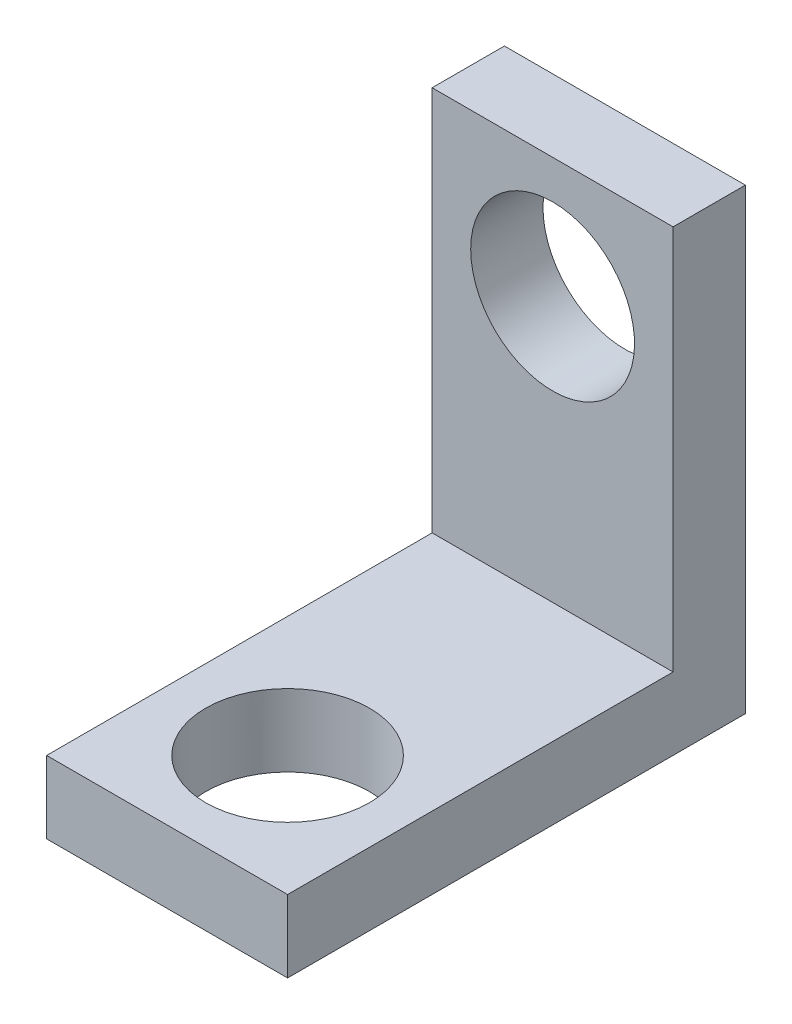
ISO-10303-21;
HEADER;
FILE_DESCRIPTION(('STEP AP214'),'2;1');
FILE_NAME('part.step','',(''),(''),'','','');
FILE_SCHEMA(('AUTOMOTIVE_DESIGN { 1 0 10303 214 1 1 1 1 }'));
ENDSEC;
DATA;
#1=APPLICATION_CONTEXT('core data for automotive mechanical design processes');
#2=APPLICATION_PROTOCOL_DEFINITION('international standard','automotive_design',2000,#1);
#3=PRODUCT_CONTEXT('',#1,'mechanical');
#4=PRODUCT('Part','Part','',(#3));
#5=PRODUCT_RELATED_PRODUCT_CATEGORY('part','',(#4));
#6=PRODUCT_DEFINITION_FORMATION('','',#4);
#7=PRODUCT_DEFINITION_CONTEXT('part definition',#1,'design');
#8=PRODUCT_DEFINITION('design','',#6,#7);
#9=PRODUCT_DEFINITION_SHAPE('','',#8);
#10=(LENGTH_UNIT() NAMED_UNIT(*) SI_UNIT(.MILLI.,.METRE.));
#11=(NAMED_UNIT(*) PLANE_ANGLE_UNIT() SI_UNIT($,.RADIAN.));
#12=(NAMED_UNIT(*) SI_UNIT($,.STERADIAN.) SOLID_ANGLE_UNIT());
#13=UNCERTAINTY_MEASURE_WITH_UNIT(LENGTH_MEASURE(1.E-05),#10,'distance_accuracy_value','');
#14=(GEOMETRIC_REPRESENTATION_CONTEXT(3) GLOBAL_UNCERTAINTY_ASSIGNED_CONTEXT((#13)) GLOBAL_UNIT_ASSIGNED_CONTEXT((#10,
#11,#12)) REPRESENTATION_CONTEXT('',''));
#15=CARTESIAN_POINT('',(0.,0.,0.));
#16=DIRECTION('',(0.,0.,1.));
#17=DIRECTION('',(1.,0.,0.));
#18=AXIS2_PLACEMENT_3D('',#15,#16,#17);
#19=CARTESIAN_POINT('',(5.,4.75,0.));
#20=DIRECTION('',(0.,1.,0.));
#21=DIRECTION('',(0.,0.,1.));
#22=AXIS2_PLACEMENT_3D('',#19,#20,#21);
#23=PLANE('',#22);
#24=DIRECTION('',(0.,0.,-1.));
#25=VECTOR('',#24,1.);
#26=CARTESIAN_POINT('',(0.,4.75,0.));
#27=LINE('',#26,#25);
#28=CARTESIAN_POINT('',(0.,4.75,-3.25));
#29=VERTEX_POINT('',#28);
#30=CARTESIAN_POINT('',(0.,4.75,-4.75));
#31=VERTEX_POINT('',#30);
#32=EDGE_CURVE('E117',#29,#31,#27,.T.);
#33=ORIENTED_EDGE('',*,*,#32,.F.);
#34=DIRECTION('',(-1.,0.,0.));
#35=VECTOR('',#34,1.);
#36=CARTESIAN_POINT('',(5.,4.75,-3.25));
#37=LINE('',#36,#35);
#38=CARTESIAN_POINT('',(5.,4.75,-3.25));
#39=VERTEX_POINT('',#38);
#40=EDGE_CURVE('E11',#39,#29,#37,.T.);
#41=ORIENTED_EDGE('',*,*,#40,.F.);
#42=DIRECTION('',(0.,0.,-1.));
#43=VECTOR('',#42,1.);
#44=CARTESIAN_POINT('',(5.,4.75,0.));
#45=LINE('',#44,#43);
#46=CARTESIAN_POINT('',(5.,4.75,-4.75));
#47=VERTEX_POINT('',#46);
#48=EDGE_CURVE('E131',#39,#47,#45,.T.);
#49=ORIENTED_EDGE('',*,*,#48,.T.);
#50=DIRECTION('',(-1.,0.,0.));
#51=VECTOR('',#50,1.);
#52=CARTESIAN_POINT('',(5.,4.75,-4.75));
#53=LINE('',#52,#51);
#54=EDGE_CURVE('E79',#47,#31,#53,.T.);
#55=ORIENTED_EDGE('',*,*,#54,.T.);
#56=EDGE_LOOP('',(#33,#41,#49,#55));
#57=FACE_BOUND('',#56,.T.);
#58=ADVANCED_FACE('F35',(#57),#23,.T.);
#59=CARTESIAN_POINT('',(5.,0.,-3.25));
#60=DIRECTION('',(0.,0.,-1.));
#61=DIRECTION('',(0.,1.,0.));
#62=AXIS2_PLACEMENT_3D('',#59,#60,#61);
#63=PLANE('',#62);
#64=CARTESIAN_POINT('',(2.5,2.25,-3.25));
#65=DIRECTION('',(0.,0.,-1.));
#66=DIRECTION('',(0.,1.,0.));
#67=AXIS2_PLACEMENT_3D('',#64,#65,#66);
#68=CIRCLE('',#67,1.7);
#69=CARTESIAN_POINT('',(2.5,3.95,-3.25));
#70=VERTEX_POINT('',#69);
#71=EDGE_CURVE('E121',#70,#70,#68,.T.);
#72=ORIENTED_EDGE('',*,*,#71,.T.);
#73=EDGE_LOOP('',(#72));
#74=FACE_BOUND('',#73,.T.);
#75=DIRECTION('',(0.,-1.,0.));
#76=VECTOR('',#75,1.);
#77=CARTESIAN_POINT('',(0.,0.,-3.25));
#78=LINE('',#77,#76);
#79=CARTESIAN_POINT('',(0.,-3.25,-3.25));
#80=VERTEX_POINT('',#79);
#81=EDGE_CURVE('E120',#29,#80,#78,.T.);
#82=ORIENTED_EDGE('',*,*,#81,.T.);
#83=DIRECTION('',(-1.,0.,0.));
#84=VECTOR('',#83,1.);
#85=CARTESIAN_POINT('',(5.,-3.25,-3.25));
#86=LINE('',#85,#84);
#87=CARTESIAN_POINT('',(5.,-3.25,-3.25));
#88=VERTEX_POINT('',#87);
#89=EDGE_CURVE('E43',#88,#80,#86,.T.);
#90=ORIENTED_EDGE('',*,*,#89,.F.);
#91=DIRECTION('',(0.,-1.,0.));
#92=VECTOR('',#91,1.);
#93=CARTESIAN_POINT('',(5.,0.,-3.25));
#94=LINE('',#93,#92);
#95=EDGE_CURVE('E112',#39,#88,#94,.T.);
#96=ORIENTED_EDGE('',*,*,#95,.F.);
#97=ORIENTED_EDGE('',*,*,#40,.T.);
#98=EDGE_LOOP('',(#82,#90,#96,#97));
#99=FACE_BOUND('',#98,.T.);
#100=ADVANCED_FACE('F140',(#74,#99),#63,.F.);
#101=CARTESIAN_POINT('',(5.,-3.25,0.));
#102=DIRECTION('',(0.,1.,0.));
#103=DIRECTION('',(0.,0.,1.));
#104=AXIS2_PLACEMENT_3D('',#101,#102,#103);
#105=PLANE('',#104);
#106=CARTESIAN_POINT('',(2.5,-3.25,2.25));
#107=DIRECTION('',(0.,1.,0.));
#108=DIRECTION('',(0.,0.,1.));
#109=AXIS2_PLACEMENT_3D('',#106,#107,#108);
#110=CIRCLE('',#109,1.7);
#111=CARTESIAN_POINT('',(2.5,-3.25,3.95));
#112=VERTEX_POINT('',#111);
#113=EDGE_CURVE('E153',#112,#112,#110,.T.);
#114=ORIENTED_EDGE('',*,*,#113,.F.);
#115=EDGE_LOOP('',(#114));
#116=FACE_BOUND('',#115,.T.);
#117=DIRECTION('',(0.,0.,-1.));
#118=VECTOR('',#117,1.);
#119=CARTESIAN_POINT('',(0.,-3.25,0.));
#120=LINE('',#119,#118);
#121=CARTESIAN_POINT('',(0.,-3.25,4.75));
#122=VERTEX_POINT('',#121);
#123=EDGE_CURVE('E124',#122,#80,#120,.T.);
#124=ORIENTED_EDGE('',*,*,#123,.F.);
#125=DIRECTION('',(-1.,0.,0.));
#126=VECTOR('',#125,1.);
#127=CARTESIAN_POINT('',(5.,-3.25,4.75));
#128=LINE('',#127,#126);
#129=CARTESIAN_POINT('',(5.,-3.25,4.75));
#130=VERTEX_POINT('',#129);
#131=EDGE_CURVE('E101',#130,#122,#128,.T.);
#132=ORIENTED_EDGE('',*,*,#131,.F.);
#133=DIRECTION('',(0.,0.,-1.));
#134=VECTOR('',#133,1.);
#135=CARTESIAN_POINT('',(5.,-3.25,0.));
#136=LINE('',#135,#134);
#137=EDGE_CURVE('E110',#130,#88,#136,.T.);
#138=ORIENTED_EDGE('',*,*,#137,.T.);
#139=ORIENTED_EDGE('',*,*,#89,.T.);
#140=EDGE_LOOP('',(#124,#132,#138,#139));
#141=FACE_BOUND('',#140,.T.);
#142=ADVANCED_FACE('F137',(#116,#141),#105,.T.);
#143=CARTESIAN_POINT('',(5.,0.,4.75));
#144=DIRECTION('',(0.,0.,1.));
#145=DIRECTION('',(0.,-1.,0.));
#146=AXIS2_PLACEMENT_3D('',#143,#144,#145);
#147=PLANE('',#146);
#148=DIRECTION('',(0.,1.,0.));
#149=VECTOR('',#148,1.);
#150=CARTESIAN_POINT('',(0.,0.,4.75));
#151=LINE('',#150,#149);
#152=CARTESIAN_POINT('',(0.,-4.75,4.75));
#153=VERTEX_POINT('',#152);
#154=EDGE_CURVE('E100',#153,#122,#151,.T.);
#155=ORIENTED_EDGE('',*,*,#154,.F.);
#156=DIRECTION('',(-1.,0.,0.));
#157=VECTOR('',#156,1.);
#158=CARTESIAN_POINT('',(5.,-4.75,4.75));
#159=LINE('',#158,#157);
#160=CARTESIAN_POINT('',(5.,-4.75,4.75));
#161=VERTEX_POINT('',#160);
#162=EDGE_CURVE('E94',#161,#153,#159,.T.);
#163=ORIENTED_EDGE('',*,*,#162,.F.);
#164=DIRECTION('',(0.,1.,0.));
#165=VECTOR('',#164,1.);
#166=CARTESIAN_POINT('',(5.,0.,4.75));
#167=LINE('',#166,#165);
#168=EDGE_CURVE('E98',#161,#130,#167,.T.);
#169=ORIENTED_EDGE('',*,*,#168,.T.);
#170=ORIENTED_EDGE('',*,*,#131,.T.);
#171=EDGE_LOOP('',(#155,#163,#169,#170));
#172=FACE_BOUND('',#171,.T.);
#173=ADVANCED_FACE('F96',(#172),#147,.T.);
#174=CARTESIAN_POINT('',(5.,-4.75,0.));
#175=DIRECTION('',(0.,1.,0.));
#176=DIRECTION('',(0.,0.,1.));
#177=AXIS2_PLACEMENT_3D('',#174,#175,#176);
#178=PLANE('',#177);
#179=CARTESIAN_POINT('',(2.5,-4.75,2.25));
#180=DIRECTION('',(0.,-1.,0.));
#181=DIRECTION('',(0.,0.,-1.));
#182=AXIS2_PLACEMENT_3D('',#179,#180,#181);
#183=CIRCLE('',#182,1.7);
#184=CARTESIAN_POINT('',(2.5,-4.75,0.549999999999999));
#185=VERTEX_POINT('',#184);
#186=EDGE_CURVE('E156',#185,#185,#183,.T.);
#187=ORIENTED_EDGE('',*,*,#186,.F.);
#188=EDGE_LOOP('',(#187));
#189=FACE_BOUND('',#188,.T.);
#190=DIRECTION('',(0.,0.,-1.));
#191=VECTOR('',#190,1.);
#192=CARTESIAN_POINT('',(0.,-4.75,0.));
#193=LINE('',#192,#191);
#194=CARTESIAN_POINT('',(0.,-4.75,-4.75));
#195=VERTEX_POINT('',#194);
#196=EDGE_CURVE('E72',#153,#195,#193,.T.);
#197=ORIENTED_EDGE('',*,*,#196,.T.);
#198=DIRECTION('',(-1.,0.,0.));
#199=VECTOR('',#198,1.);
#200=CARTESIAN_POINT('',(5.,-4.75,-4.75));
#201=LINE('',#200,#199);
#202=CARTESIAN_POINT('',(5.,-4.75,-4.75));
#203=VERTEX_POINT('',#202);
#204=EDGE_CURVE('E102',#203,#195,#201,.T.);
#205=ORIENTED_EDGE('',*,*,#204,.F.);
#206=DIRECTION('',(0.,0.,-1.));
#207=VECTOR('',#206,1.);
#208=CARTESIAN_POINT('',(5.,-4.75,0.));
#209=LINE('',#208,#207);
#210=EDGE_CURVE('E104',#161,#203,#209,.T.);
#211=ORIENTED_EDGE('',*,*,#210,.F.);
#212=ORIENTED_EDGE('',*,*,#162,.T.);
#213=EDGE_LOOP('',(#197,#205,#211,#212));
#214=FACE_BOUND('',#213,.T.);
#215=ADVANCED_FACE('F105',(#189,#214),#178,.F.);
#216=CARTESIAN_POINT('',(5.,0.,-4.75));
#217=DIRECTION('',(0.,0.,1.));
#218=DIRECTION('',(1.,0.,0.));
#219=AXIS2_PLACEMENT_3D('',#216,#217,#218);
#220=PLANE('',#219);
#221=CARTESIAN_POINT('',(2.5,2.25,-4.75));
#222=DIRECTION('',(0.,0.,-1.));
#223=DIRECTION('',(-1.,0.,0.));
#224=AXIS2_PLACEMENT_3D('',#221,#222,#223);
#225=CIRCLE('',#224,1.7);
#226=CARTESIAN_POINT('',(0.8,2.25,-4.75));
#227=VERTEX_POINT('',#226);
#228=EDGE_CURVE('E150',#227,#227,#225,.T.);
#229=ORIENTED_EDGE('',*,*,#228,.F.);
#230=EDGE_LOOP('',(#229));
#231=FACE_BOUND('',#230,.T.);
#232=DIRECTION('',(0.,1.,0.));
#233=VECTOR('',#232,1.);
#234=CARTESIAN_POINT('',(0.,0.,-4.75));
#235=LINE('',#234,#233);
#236=EDGE_CURVE('E129',#195,#31,#235,.T.);
#237=ORIENTED_EDGE('',*,*,#236,.T.);
#238=ORIENTED_EDGE('',*,*,#54,.F.);
#239=DIRECTION('',(0.,1.,0.));
#240=VECTOR('',#239,1.);
#241=CARTESIAN_POINT('',(5.,0.,-4.75));
#242=LINE('',#241,#240);
#243=EDGE_CURVE('E51',#203,#47,#242,.T.);
#244=ORIENTED_EDGE('',*,*,#243,.F.);
#245=ORIENTED_EDGE('',*,*,#204,.T.);
#246=EDGE_LOOP('',(#237,#238,#244,#245));
#247=FACE_BOUND('',#246,.T.);
#248=ADVANCED_FACE('F145',(#231,#247),#220,.F.);
#249=CARTESIAN_POINT('',(5.,0.,0.));
#250=DIRECTION('',(1.,0.,0.));
#251=DIRECTION('',(0.,0.,-1.));
#252=AXIS2_PLACEMENT_3D('',#249,#250,#251);
#253=PLANE('',#252);
#254=ORIENTED_EDGE('',*,*,#48,.F.);
#255=ORIENTED_EDGE('',*,*,#95,.T.);
#256=ORIENTED_EDGE('',*,*,#137,.F.);
#257=ORIENTED_EDGE('',*,*,#168,.F.);
#258=ORIENTED_EDGE('',*,*,#210,.T.);
#259=ORIENTED_EDGE('',*,*,#243,.T.);
#260=EDGE_LOOP('',(#254,#255,#256,#257,#258,#259));
#261=FACE_BOUND('',#260,.T.);
#262=ADVANCED_FACE('F108',(#261),#253,.T.);
#263=CARTESIAN_POINT('',(0.,0.,0.));
#264=DIRECTION('',(1.,0.,0.));
#265=DIRECTION('',(0.,0.,-1.));
#266=AXIS2_PLACEMENT_3D('',#263,#264,#265);
#267=PLANE('',#266);
#268=ORIENTED_EDGE('',*,*,#32,.T.);
#269=ORIENTED_EDGE('',*,*,#236,.F.);
#270=ORIENTED_EDGE('',*,*,#196,.F.);
#271=ORIENTED_EDGE('',*,*,#154,.T.);
#272=ORIENTED_EDGE('',*,*,#123,.T.);
#273=ORIENTED_EDGE('',*,*,#81,.F.);
#274=EDGE_LOOP('',(#268,#269,#270,#271,#272,#273));
#275=FACE_BOUND('',#274,.T.);
#276=ADVANCED_FACE('F142',(#275),#267,.F.);
#277=CARTESIAN_POINT('',(2.5,2.25,4.75));
#278=DIRECTION('',(0.,0.,-1.));
#279=DIRECTION('',(-1.,0.,0.));
#280=AXIS2_PLACEMENT_3D('',#277,#278,#279);
#281=CYLINDRICAL_SURFACE('',#280,1.7);
#282=ORIENTED_EDGE('',*,*,#228,.T.);
#283=EDGE_LOOP('',(#282));
#284=FACE_BOUND('',#283,.T.);
#285=ORIENTED_EDGE('',*,*,#71,.F.);
#286=EDGE_LOOP('',(#285));
#287=FACE_BOUND('',#286,.T.);
#288=ADVANCED_FACE('F183',(#284,#287),#281,.F.);
#289=CARTESIAN_POINT('',(2.5,4.75,2.25));
#290=DIRECTION('',(0.,-1.,0.));
#291=DIRECTION('',(0.,0.,-1.));
#292=AXIS2_PLACEMENT_3D('',#289,#290,#291);
#293=CYLINDRICAL_SURFACE('',#292,1.7);
#294=ORIENTED_EDGE('',*,*,#113,.T.);
#295=EDGE_LOOP('',(#294));
#296=FACE_BOUND('',#295,.T.);
#297=ORIENTED_EDGE('',*,*,#186,.T.);
#298=EDGE_LOOP('',(#297));
#299=FACE_BOUND('',#298,.T.);
#300=ADVANCED_FACE('F160',(#296,#299),#293,.F.);
#301=CLOSED_SHELL('',(#58,#100,#142,#173,#215,#248,#262,#276,#288,#300));
#302=MANIFOLD_SOLID_BREP('B2',#301);
#303=ADVANCED_BREP_SHAPE_REPRESENTATION('',(#18,#302),#14);
#304=SHAPE_DEFINITION_REPRESENTATION(#9,#303);
ENDSEC;
END-ISO-10303-21;
